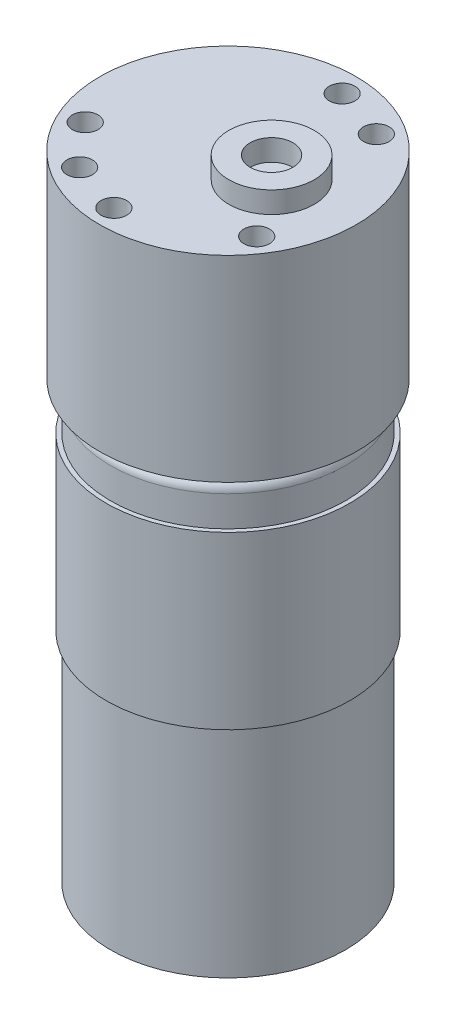
ISO-10303-21;
HEADER;
FILE_DESCRIPTION(('STEP AP214'),'2;1');
FILE_NAME('part.step','',(''),(''),'','','');
FILE_SCHEMA(('AUTOMOTIVE_DESIGN { 1 0 10303 214 1 1 1 1 }'));
ENDSEC;
DATA;
#1=APPLICATION_CONTEXT('core data for automotive mechanical design processes');
#2=APPLICATION_PROTOCOL_DEFINITION('international standard','automotive_design',2000,#1);
#3=PRODUCT_CONTEXT('',#1,'mechanical');
#4=PRODUCT('Part','Part','',(#3));
#5=PRODUCT_RELATED_PRODUCT_CATEGORY('part','',(#4));
#6=PRODUCT_DEFINITION_FORMATION('','',#4);
#7=PRODUCT_DEFINITION_CONTEXT('part definition',#1,'design');
#8=PRODUCT_DEFINITION('design','',#6,#7);
#9=PRODUCT_DEFINITION_SHAPE('','',#8);
#10=(LENGTH_UNIT() NAMED_UNIT(*) SI_UNIT(.MILLI.,.METRE.));
#11=(NAMED_UNIT(*) PLANE_ANGLE_UNIT() SI_UNIT($,.RADIAN.));
#12=(NAMED_UNIT(*) SI_UNIT($,.STERADIAN.) SOLID_ANGLE_UNIT());
#13=UNCERTAINTY_MEASURE_WITH_UNIT(LENGTH_MEASURE(1.E-05),#10,'distance_accuracy_value','');
#14=(GEOMETRIC_REPRESENTATION_CONTEXT(3) GLOBAL_UNCERTAINTY_ASSIGNED_CONTEXT((#13)) GLOBAL_UNIT_ASSIGNED_CONTEXT((#10,
#11,#12)) REPRESENTATION_CONTEXT('',''));
#15=CARTESIAN_POINT('',(0.,0.,0.));
#16=DIRECTION('',(0.,0.,1.));
#17=DIRECTION('',(1.,0.,0.));
#18=AXIS2_PLACEMENT_3D('',#15,#16,#17);
#19=CARTESIAN_POINT('',(69.4163706857569,10.76,4.59413157618666E-13));
#20=DIRECTION('',(0.,-1.,0.));
#21=DIRECTION('',(0.070672985305467,0.,-0.99749953841995));
#22=AXIS2_PLACEMENT_3D('',#19,#20,#21);
#23=TOROIDAL_SURFACE('',#22,12.51,1.24);
#24=CARTESIAN_POINT('',(69.4163706857568,12.,5.10957146463224E-13));
#25=DIRECTION('',(0.,-1.,0.));
#26=DIRECTION('',(0.070672985305467,0.,-0.99749953841995));
#27=AXIS2_PLACEMENT_3D('',#24,#25,#26);
#28=CIRCLE('',#27,12.51);
#29=CARTESIAN_POINT('',(70.3004897319282,12.0000000000006,-12.478719225633));
#30=VERTEX_POINT('',#29);
#31=EDGE_CURVE('E74',#30,#30,#28,.T.);
#32=ORIENTED_EDGE('',*,*,#31,.T.);
#33=EDGE_LOOP('',(#32));
#34=FACE_BOUND('',#33,.T.);
#35=CARTESIAN_POINT('',(69.4163706857569,10.76,4.59404884746867E-13));
#36=DIRECTION('',(0.,-1.,0.));
#37=DIRECTION('',(0.070672985305467,0.,-0.99749953841995));
#38=AXIS2_PLACEMENT_3D('',#35,#36,#37);
#39=CIRCLE('',#38,13.75);
#40=CARTESIAN_POINT('',(70.388124233707,10.7600000000006,-13.7156186532738));
#41=VERTEX_POINT('',#40);
#42=EDGE_CURVE('E40',#41,#41,#39,.T.);
#43=ORIENTED_EDGE('',*,*,#42,.F.);
#44=EDGE_LOOP('',(#43));
#45=FACE_BOUND('',#44,.T.);
#46=ADVANCED_FACE('F34',(#34,#45),#23,.T.);
#47=CARTESIAN_POINT('',(69.4163706857578,-64.0943122375827,-2.65261857901902E-12));
#48=DIRECTION('',(0.,-1.,0.));
#49=DIRECTION('',(0.070672985305467,0.,-0.99749953841995));
#50=AXIS2_PLACEMENT_3D('',#47,#48,#49);
#51=CYLINDRICAL_SURFACE('',#50,13.75);
#52=ORIENTED_EDGE('',*,*,#42,.T.);
#53=EDGE_LOOP('',(#52));
#54=FACE_BOUND('',#53,.T.);
#55=CARTESIAN_POINT('',(69.4163706857569,7.20000000000005,3.11400004335394E-13));
#56=DIRECTION('',(0.,-1.,0.));
#57=DIRECTION('',(0.070672985305467,0.,-0.99749953841995));
#58=AXIS2_PLACEMENT_3D('',#55,#56,#57);
#59=CIRCLE('',#58,13.75);
#60=CARTESIAN_POINT('',(70.3881242337071,7.20000000000063,-13.715618653274));
#61=VERTEX_POINT('',#60);
#62=EDGE_CURVE('E44',#61,#61,#59,.T.);
#63=ORIENTED_EDGE('',*,*,#62,.F.);
#64=EDGE_LOOP('',(#63));
#65=FACE_BOUND('',#64,.T.);
#66=ADVANCED_FACE('F142',(#54,#65),#51,.T.);
#67=CARTESIAN_POINT('',(83.1319893390312,7.20000000000018,0.971753547950482));
#68=DIRECTION('',(0.,1.,0.));
#69=DIRECTION('',(-0.070672985305467,0.,0.99749953841995));
#70=AXIS2_PLACEMENT_3D('',#67,#68,#69);
#71=PLANE('',#70);
#72=ORIENTED_EDGE('',*,*,#62,.T.);
#73=EDGE_LOOP('',(#72));
#74=FACE_BOUND('',#73,.T.);
#75=CARTESIAN_POINT('',(69.4163706857569,7.20000000000005,3.11400004335394E-13));
#76=DIRECTION('',(0.,-1.,0.));
#77=DIRECTION('',(0.070672985305467,0.,-0.99749953841995));
#78=AXIS2_PLACEMENT_3D('',#75,#76,#77);
#79=CIRCLE('',#78,14.25);
#80=CARTESIAN_POINT('',(70.4234607263598,7.20000000000065,-14.214368422484));
#81=VERTEX_POINT('',#80);
#82=EDGE_CURVE('E48',#81,#81,#79,.T.);
#83=ORIENTED_EDGE('',*,*,#82,.F.);
#84=EDGE_LOOP('',(#83));
#85=FACE_BOUND('',#84,.T.);
#86=ADVANCED_FACE('F147',(#74,#85),#71,.T.);
#87=CARTESIAN_POINT('',(69.4163706857578,-64.0943122375827,-2.65261857901902E-12));
#88=DIRECTION('',(0.,-1.,0.));
#89=DIRECTION('',(0.070672985305467,0.,-0.99749953841995));
#90=AXIS2_PLACEMENT_3D('',#87,#88,#89);
#91=CYLINDRICAL_SURFACE('',#90,14.25);
#92=ORIENTED_EDGE('',*,*,#82,.T.);
#93=EDGE_LOOP('',(#92));
#94=FACE_BOUND('',#93,.T.);
#95=CARTESIAN_POINT('',(69.4163706857572,-12.8,-5.20088087863897E-13));
#96=DIRECTION('',(0.,-1.,0.));
#97=DIRECTION('',(0.070672985305467,0.,-0.99749953841995));
#98=AXIS2_PLACEMENT_3D('',#95,#96,#97);
#99=CIRCLE('',#98,14.25);
#100=CARTESIAN_POINT('',(70.4234607263601,-12.7999999999994,-14.2143684224848));
#101=VERTEX_POINT('',#100);
#102=EDGE_CURVE('E53',#101,#101,#99,.T.);
#103=ORIENTED_EDGE('',*,*,#102,.F.);
#104=EDGE_LOOP('',(#103));
#105=FACE_BOUND('',#104,.T.);
#106=ADVANCED_FACE('F192',(#94,#105),#91,.T.);
#107=CARTESIAN_POINT('',(83.6307391082414,-12.7999999999998,1.00709004060238));
#108=DIRECTION('',(0.,-1.,0.));
#109=DIRECTION('',(0.070672985305467,0.,-0.99749953841995));
#110=AXIS2_PLACEMENT_3D('',#107,#108,#109);
#111=PLANE('',#110);
#112=ORIENTED_EDGE('',*,*,#102,.T.);
#113=EDGE_LOOP('',(#112));
#114=FACE_BOUND('',#113,.T.);
#115=CARTESIAN_POINT('',(69.4163706857572,-12.8,-5.20088087863897E-13));
#116=DIRECTION('',(0.,-1.,0.));
#117=DIRECTION('',(0.070672985305467,0.,-0.99749953841995));
#118=AXIS2_PLACEMENT_3D('',#115,#116,#117);
#119=CIRCLE('',#118,13.75);
#120=CARTESIAN_POINT('',(70.3881242337073,-12.7999999999994,-13.7156186532748));
#121=VERTEX_POINT('',#120);
#122=EDGE_CURVE('E56',#121,#121,#119,.T.);
#123=ORIENTED_EDGE('',*,*,#122,.F.);
#124=EDGE_LOOP('',(#123));
#125=FACE_BOUND('',#124,.T.);
#126=ADVANCED_FACE('F188',(#114,#125),#111,.T.);
#127=CARTESIAN_POINT('',(69.4163706857578,-64.0943122375827,-2.65261857901902E-12));
#128=DIRECTION('',(0.,-1.,0.));
#129=DIRECTION('',(0.070672985305467,0.,-0.99749953841995));
#130=AXIS2_PLACEMENT_3D('',#127,#128,#129);
#131=CYLINDRICAL_SURFACE('',#130,13.75);
#132=ORIENTED_EDGE('',*,*,#122,.T.);
#133=EDGE_LOOP('',(#132));
#134=FACE_BOUND('',#133,.T.);
#135=CARTESIAN_POINT('',(69.4163706857575,-38.2999999999999,-1.58023540541799E-12));
#136=DIRECTION('',(0.,-1.,0.));
#137=DIRECTION('',(0.070672985305467,0.,-0.99749953841995));
#138=AXIS2_PLACEMENT_3D('',#135,#136,#137);
#139=CIRCLE('',#138,13.75);
#140=CARTESIAN_POINT('',(70.3881242337077,-38.2999999999994,-13.7156186532759));
#141=VERTEX_POINT('',#140);
#142=EDGE_CURVE('E59',#141,#141,#139,.T.);
#143=ORIENTED_EDGE('',*,*,#142,.F.);
#144=EDGE_LOOP('',(#143));
#145=FACE_BOUND('',#144,.T.);
#146=ADVANCED_FACE('F184',(#134,#145),#131,.T.);
#147=CARTESIAN_POINT('',(69.4163706857575,-38.2999999999999,-1.58032793038194E-12));
#148=DIRECTION('',(0.,-1.,0.));
#149=DIRECTION('',(0.070672985305467,0.,-0.99749953841995));
#150=AXIS2_PLACEMENT_3D('',#147,#148,#149);
#151=PLANE('',#150);
#152=ORIENTED_EDGE('',*,*,#142,.T.);
#153=EDGE_LOOP('',(#152));
#154=FACE_BOUND('',#153,.T.);
#155=ADVANCED_FACE('F179',(#154),#151,.T.);
#156=CARTESIAN_POINT('',(69.4163706857565,35.8000000000001,1.50042797618038E-12));
#157=DIRECTION('',(0.,1.,0.));
#158=DIRECTION('',(-0.070672985305467,0.,0.99749953841995));
#159=AXIS2_PLACEMENT_3D('',#156,#157,#158);
#160=PLANE('',#159);
#161=CARTESIAN_POINT('',(74.9026181470663,35.8000000000001,0.388701419181569));
#162=DIRECTION('',(0.,1.,0.));
#163=DIRECTION('',(-0.070672985305467,0.,0.99749953841995));
#164=AXIS2_PLACEMENT_3D('',#161,#162,#163);
#165=CIRCLE('',#164,5.);
#166=CARTESIAN_POINT('',(74.5492532205389,35.7999999999999,5.37619911128132));
#167=VERTEX_POINT('',#166);
#168=EDGE_CURVE('E114',#167,#167,#165,.T.);
#169=ORIENTED_EDGE('',*,*,#168,.F.);
#170=EDGE_LOOP('',(#169));
#171=FACE_BOUND('',#170,.T.);
#172=CARTESIAN_POINT('',(58.1764152709107,35.7999999999997,5.46931460717845));
#173=DIRECTION('',(0.,1.,0.));
#174=DIRECTION('',(-0.070672985305467,0.,0.99749953841995));
#175=AXIS2_PLACEMENT_3D('',#172,#173,#174);
#176=CIRCLE('',#175,1.5);
#177=CARTESIAN_POINT('',(58.0704057929525,35.7999999999996,6.96556391480837));
#178=VERTEX_POINT('',#177);
#179=EDGE_CURVE('E84',#178,#178,#176,.T.);
#180=ORIENTED_EDGE('',*,*,#179,.F.);
#181=EDGE_LOOP('',(#180));
#182=FACE_BOUND('',#181,.T.);
#183=CARTESIAN_POINT('',(62.4169410626841,35.7999999999995,10.3565430985289));
#184=DIRECTION('',(0.,1.,0.));
#185=DIRECTION('',(-0.070672985305467,0.,0.99749953841995));
#186=AXIS2_PLACEMENT_3D('',#183,#184,#185);
#187=CIRCLE('',#186,1.5);
#188=CARTESIAN_POINT('',(62.3109315847259,35.7999999999995,11.8527924061589));
#189=VERTEX_POINT('',#188);
#190=EDGE_CURVE('E91',#189,#189,#187,.T.);
#191=ORIENTED_EDGE('',*,*,#190,.F.);
#192=EDGE_LOOP('',(#191));
#193=FACE_BOUND('',#192,.T.);
#194=CARTESIAN_POINT('',(68.5329583694382,35.7999999999995,12.4687442302509));
#195=DIRECTION('',(0.,1.,0.));
#196=DIRECTION('',(-0.070672985305467,0.,0.99749953841995));
#197=AXIS2_PLACEMENT_3D('',#194,#195,#196);
#198=CIRCLE('',#197,1.5);
#199=CARTESIAN_POINT('',(68.42694889148,35.7999999999995,13.9649935378808));
#200=VERTEX_POINT('',#199);
#201=EDGE_CURVE('E97',#200,#200,#198,.T.);
#202=ORIENTED_EDGE('',*,*,#201,.F.);
#203=EDGE_LOOP('',(#202));
#204=FACE_BOUND('',#203,.T.);
#205=CARTESIAN_POINT('',(79.772913784284,35.7999999999999,6.9994296230739));
#206=DIRECTION('',(0.,1.,0.));
#207=DIRECTION('',(-0.070672985305467,0.,0.99749953841995));
#208=AXIS2_PLACEMENT_3D('',#205,#206,#207);
#209=CIRCLE('',#208,1.5);
#210=CARTESIAN_POINT('',(79.6669043063258,35.7999999999998,8.49567893070382));
#211=VERTEX_POINT('',#210);
#212=EDGE_CURVE('E103',#211,#211,#209,.T.);
#213=ORIENTED_EDGE('',*,*,#212,.F.);
#214=EDGE_LOOP('',(#213));
#215=FACE_BOUND('',#214,.T.);
#216=CARTESIAN_POINT('',(76.4158003088289,35.8000000000006,-10.356543098526));
#217=DIRECTION('',(0.,1.,0.));
#218=DIRECTION('',(-0.070672985305467,0.,0.99749953841995));
#219=AXIS2_PLACEMENT_3D('',#216,#217,#218);
#220=CIRCLE('',#219,1.5);
#221=CARTESIAN_POINT('',(76.3097908308707,35.8000000000005,-8.86029379089603));
#222=VERTEX_POINT('',#221);
#223=EDGE_CURVE('E109',#222,#222,#220,.T.);
#224=ORIENTED_EDGE('',*,*,#223,.F.);
#225=EDGE_LOOP('',(#224));
#226=FACE_BOUND('',#225,.T.);
#227=CARTESIAN_POINT('',(70.2997830020749,35.8000000000006,-12.4687442302479));
#228=DIRECTION('',(0.,1.,0.));
#229=DIRECTION('',(-0.070672985305467,0.,0.99749953841995));
#230=AXIS2_PLACEMENT_3D('',#227,#228,#229);
#231=CIRCLE('',#230,1.5);
#232=CARTESIAN_POINT('',(70.1937735241167,35.8000000000005,-10.972494922618));
#233=VERTEX_POINT('',#232);
#234=EDGE_CURVE('E78',#233,#233,#231,.T.);
#235=ORIENTED_EDGE('',*,*,#234,.F.);
#236=EDGE_LOOP('',(#235));
#237=FACE_BOUND('',#236,.T.);
#238=CARTESIAN_POINT('',(69.4163706857565,35.8000000000001,1.50042797618038E-12));
#239=DIRECTION('',(0.,-1.,0.));
#240=DIRECTION('',(0.070672985305467,0.,-0.99749953841995));
#241=AXIS2_PLACEMENT_3D('',#238,#239,#240);
#242=CIRCLE('',#241,15.0045873798302);
#243=CARTESIAN_POINT('',(70.4767896691659,35.8000000000007,-14.9670689855609));
#244=VERTEX_POINT('',#243);
#245=EDGE_CURVE('E62',#244,#244,#242,.T.);
#246=ORIENTED_EDGE('',*,*,#245,.F.);
#247=EDGE_LOOP('',(#246));
#248=FACE_BOUND('',#247,.T.);
#249=ADVANCED_FACE('F175',(#171,#182,#193,#204,#215,#226,#237,#248),#160,.T.);
#250=CARTESIAN_POINT('',(69.4163706857578,-64.0943122375827,-2.65261857901902E-12));
#251=DIRECTION('',(0.,-1.,0.));
#252=DIRECTION('',(0.070672985305467,0.,-0.99749953841995));
#253=AXIS2_PLACEMENT_3D('',#250,#251,#252);
#254=CYLINDRICAL_SURFACE('',#253,15.0045873798302);
#255=ORIENTED_EDGE('',*,*,#245,.T.);
#256=EDGE_LOOP('',(#255));
#257=FACE_BOUND('',#256,.T.);
#258=CARTESIAN_POINT('',(69.4163706857568,12.8,5.44216670151195E-13));
#259=DIRECTION('',(0.,-1.,0.));
#260=DIRECTION('',(0.070672985305467,0.,-0.99749953841995));
#261=AXIS2_PLACEMENT_3D('',#258,#259,#260);
#262=CIRCLE('',#261,15.0045873798302);
#263=CARTESIAN_POINT('',(70.4767896691662,12.8000000000007,-14.9670689855619));
#264=VERTEX_POINT('',#263);
#265=EDGE_CURVE('E65',#264,#264,#262,.T.);
#266=ORIENTED_EDGE('',*,*,#265,.F.);
#267=EDGE_LOOP('',(#266));
#268=FACE_BOUND('',#267,.T.);
#269=ADVANCED_FACE('F171',(#257,#268),#254,.T.);
#270=CARTESIAN_POINT('',(84.3834396713193,12.8000000000002,1.06041898340988));
#271=DIRECTION('',(0.,-1.,0.));
#272=DIRECTION('',(0.070672985305467,0.,-0.99749953841995));
#273=AXIS2_PLACEMENT_3D('',#270,#271,#272);
#274=PLANE('',#273);
#275=ORIENTED_EDGE('',*,*,#265,.T.);
#276=EDGE_LOOP('',(#275));
#277=FACE_BOUND('',#276,.T.);
#278=CARTESIAN_POINT('',(69.4163706857568,12.8,5.44216670151195E-13));
#279=DIRECTION('',(0.,-1.,0.));
#280=DIRECTION('',(0.070672985305467,0.,-0.99749953841995));
#281=AXIS2_PLACEMENT_3D('',#278,#279,#280);
#282=CIRCLE('',#281,12.5);
#283=CARTESIAN_POINT('',(70.2997830020752,12.8000000000006,-12.4687442302488));
#284=VERTEX_POINT('',#283);
#285=EDGE_CURVE('E68',#284,#284,#282,.T.);
#286=ORIENTED_EDGE('',*,*,#285,.F.);
#287=EDGE_LOOP('',(#286));
#288=FACE_BOUND('',#287,.T.);
#289=ADVANCED_FACE('F164',(#277,#288),#274,.T.);
#290=CARTESIAN_POINT('',(69.4163706857578,-64.0943122375827,-2.65261857901902E-12));
#291=DIRECTION('',(0.,-1.,0.));
#292=DIRECTION('',(0.070672985305467,0.,-0.99749953841995));
#293=AXIS2_PLACEMENT_3D('',#290,#291,#292);
#294=CYLINDRICAL_SURFACE('',#293,12.5);
#295=ORIENTED_EDGE('',*,*,#285,.T.);
#296=EDGE_LOOP('',(#295));
#297=FACE_BOUND('',#296,.T.);
#298=CARTESIAN_POINT('',(69.4163706857568,12.,5.10957146463224E-13));
#299=DIRECTION('',(0.,-1.,0.));
#300=DIRECTION('',(0.070672985305467,0.,-0.99749953841995));
#301=AXIS2_PLACEMENT_3D('',#298,#299,#300);
#302=CIRCLE('',#301,12.5);
#303=CARTESIAN_POINT('',(70.2997830020752,12.0000000000006,-12.4687442302489));
#304=VERTEX_POINT('',#303);
#305=EDGE_CURVE('E71',#304,#304,#302,.T.);
#306=ORIENTED_EDGE('',*,*,#305,.F.);
#307=EDGE_LOOP('',(#306));
#308=FACE_BOUND('',#307,.T.);
#309=ADVANCED_FACE('F154',(#297,#308),#294,.T.);
#310=CARTESIAN_POINT('',(81.8851149160062,12.0000000000002,0.883412316318848));
#311=DIRECTION('',(0.,1.,0.));
#312=DIRECTION('',(-0.070672985305467,0.,0.99749953841995));
#313=AXIS2_PLACEMENT_3D('',#310,#311,#312);
#314=PLANE('',#313);
#315=ORIENTED_EDGE('',*,*,#305,.T.);
#316=EDGE_LOOP('',(#315));
#317=FACE_BOUND('',#316,.T.);
#318=ORIENTED_EDGE('',*,*,#31,.F.);
#319=EDGE_LOOP('',(#318));
#320=FACE_BOUND('',#319,.T.);
#321=ADVANCED_FACE('F151',(#317,#320),#314,.T.);
#322=CARTESIAN_POINT('',(70.2997830020749,31.8000000000006,-12.468744230248));
#323=DIRECTION('',(0.,1.,0.));
#324=DIRECTION('',(-0.070672985305467,0.,0.99749953841995));
#325=AXIS2_PLACEMENT_3D('',#322,#323,#324);
#326=CYLINDRICAL_SURFACE('',#325,1.5);
#327=CARTESIAN_POINT('',(70.2997830020749,31.8000000000006,-12.468744230248));
#328=DIRECTION('',(0.,1.,0.));
#329=DIRECTION('',(-0.070672985305467,0.,0.99749953841995));
#330=AXIS2_PLACEMENT_3D('',#327,#328,#329);
#331=CIRCLE('',#330,1.5);
#332=CARTESIAN_POINT('',(70.1937735241167,31.8000000000005,-10.9724949226181));
#333=VERTEX_POINT('',#332);
#334=EDGE_CURVE('E77',#333,#333,#331,.T.);
#335=ORIENTED_EDGE('',*,*,#334,.F.);
#336=EDGE_LOOP('',(#335));
#337=FACE_BOUND('',#336,.T.);
#338=ORIENTED_EDGE('',*,*,#234,.T.);
#339=EDGE_LOOP('',(#338));
#340=FACE_BOUND('',#339,.T.);
#341=ADVANCED_FACE('F153',(#337,#340),#326,.F.);
#342=CARTESIAN_POINT('',(70.2997830020749,31.8000000000006,-12.468744230248));
#343=DIRECTION('',(0.,1.,0.));
#344=DIRECTION('',(-0.070672985305467,0.,0.99749953841995));
#345=AXIS2_PLACEMENT_3D('',#342,#343,#344);
#346=PLANE('',#345);
#347=ORIENTED_EDGE('',*,*,#334,.T.);
#348=EDGE_LOOP('',(#347));
#349=FACE_BOUND('',#348,.T.);
#350=ADVANCED_FACE('F161',(#349),#346,.T.);
#351=CARTESIAN_POINT('',(76.415800308829,31.8000000000006,-10.3565430985261));
#352=DIRECTION('',(0.,1.,0.));
#353=DIRECTION('',(-0.070672985305467,0.,0.99749953841995));
#354=AXIS2_PLACEMENT_3D('',#351,#352,#353);
#355=CYLINDRICAL_SURFACE('',#354,1.5);
#356=CARTESIAN_POINT('',(76.415800308829,31.8000000000006,-10.3565430985261));
#357=DIRECTION('',(0.,1.,0.));
#358=DIRECTION('',(-0.070672985305467,0.,0.99749953841995));
#359=AXIS2_PLACEMENT_3D('',#356,#357,#358);
#360=CIRCLE('',#359,1.5);
#361=CARTESIAN_POINT('',(76.3097908308708,31.8000000000005,-8.8602937908962));
#362=VERTEX_POINT('',#361);
#363=EDGE_CURVE('E81',#362,#362,#360,.T.);
#364=ORIENTED_EDGE('',*,*,#363,.F.);
#365=EDGE_LOOP('',(#364));
#366=FACE_BOUND('',#365,.T.);
#367=ORIENTED_EDGE('',*,*,#223,.T.);
#368=EDGE_LOOP('',(#367));
#369=FACE_BOUND('',#368,.T.);
#370=ADVANCED_FACE('F265',(#366,#369),#355,.F.);
#371=CARTESIAN_POINT('',(76.415800308829,31.8000000000006,-10.3565430985261));
#372=DIRECTION('',(0.,1.,0.));
#373=DIRECTION('',(-0.070672985305467,0.,0.99749953841995));
#374=AXIS2_PLACEMENT_3D('',#371,#372,#373);
#375=PLANE('',#374);
#376=ORIENTED_EDGE('',*,*,#363,.T.);
#377=EDGE_LOOP('',(#376));
#378=FACE_BOUND('',#377,.T.);
#379=ADVANCED_FACE('F274',(#378),#375,.T.);
#380=CARTESIAN_POINT('',(79.7729137842841,31.7999999999999,6.99942962307373));
#381=DIRECTION('',(0.,1.,0.));
#382=DIRECTION('',(-0.070672985305467,0.,0.99749953841995));
#383=AXIS2_PLACEMENT_3D('',#380,#381,#382);
#384=CYLINDRICAL_SURFACE('',#383,1.5);
#385=CARTESIAN_POINT('',(79.7729137842841,31.7999999999999,6.99942962307373));
#386=DIRECTION('',(0.,1.,0.));
#387=DIRECTION('',(-0.070672985305467,0.,0.99749953841995));
#388=AXIS2_PLACEMENT_3D('',#385,#386,#387);
#389=CIRCLE('',#388,1.5);
#390=CARTESIAN_POINT('',(79.6669043063258,31.7999999999998,8.49567893070365));
#391=VERTEX_POINT('',#390);
#392=EDGE_CURVE('E106',#391,#391,#389,.T.);
#393=ORIENTED_EDGE('',*,*,#392,.F.);
#394=EDGE_LOOP('',(#393));
#395=FACE_BOUND('',#394,.T.);
#396=ORIENTED_EDGE('',*,*,#212,.T.);
#397=EDGE_LOOP('',(#396));
#398=FACE_BOUND('',#397,.T.);
#399=ADVANCED_FACE('F284',(#395,#398),#384,.F.);
#400=CARTESIAN_POINT('',(79.7729137842841,31.7999999999999,6.99942962307373));
#401=DIRECTION('',(0.,1.,0.));
#402=DIRECTION('',(-0.070672985305467,0.,0.99749953841995));
#403=AXIS2_PLACEMENT_3D('',#400,#401,#402);
#404=PLANE('',#403);
#405=ORIENTED_EDGE('',*,*,#392,.T.);
#406=EDGE_LOOP('',(#405));
#407=FACE_BOUND('',#406,.T.);
#408=ADVANCED_FACE('F294',(#407),#404,.T.);
#409=CARTESIAN_POINT('',(68.5329583694383,31.7999999999995,12.4687442302507));
#410=DIRECTION('',(0.,1.,0.));
#411=DIRECTION('',(-0.070672985305467,0.,0.99749953841995));
#412=AXIS2_PLACEMENT_3D('',#409,#410,#411);
#413=CYLINDRICAL_SURFACE('',#412,1.5);
#414=CARTESIAN_POINT('',(68.5329583694383,31.7999999999995,12.4687442302507));
#415=DIRECTION('',(0.,1.,0.));
#416=DIRECTION('',(-0.070672985305467,0.,0.99749953841995));
#417=AXIS2_PLACEMENT_3D('',#414,#415,#416);
#418=CIRCLE('',#417,1.5);
#419=CARTESIAN_POINT('',(68.4269488914801,31.7999999999995,13.9649935378806));
#420=VERTEX_POINT('',#419);
#421=EDGE_CURVE('E100',#420,#420,#418,.T.);
#422=ORIENTED_EDGE('',*,*,#421,.F.);
#423=EDGE_LOOP('',(#422));
#424=FACE_BOUND('',#423,.T.);
#425=ORIENTED_EDGE('',*,*,#201,.T.);
#426=EDGE_LOOP('',(#425));
#427=FACE_BOUND('',#426,.T.);
#428=ADVANCED_FACE('F304',(#424,#427),#413,.F.);
#429=CARTESIAN_POINT('',(68.5329583694383,31.7999999999995,12.4687442302507));
#430=DIRECTION('',(0.,1.,0.));
#431=DIRECTION('',(-0.070672985305467,0.,0.99749953841995));
#432=AXIS2_PLACEMENT_3D('',#429,#430,#431);
#433=PLANE('',#432);
#434=ORIENTED_EDGE('',*,*,#421,.T.);
#435=EDGE_LOOP('',(#434));
#436=FACE_BOUND('',#435,.T.);
#437=ADVANCED_FACE('F314',(#436),#433,.T.);
#438=CARTESIAN_POINT('',(62.4169410626842,31.7999999999995,10.3565430985288));
#439=DIRECTION('',(0.,1.,0.));
#440=DIRECTION('',(-0.070672985305467,0.,0.99749953841995));
#441=AXIS2_PLACEMENT_3D('',#438,#439,#440);
#442=CYLINDRICAL_SURFACE('',#441,1.5);
#443=CARTESIAN_POINT('',(62.4169410626842,31.7999999999995,10.3565430985288));
#444=DIRECTION('',(0.,1.,0.));
#445=DIRECTION('',(-0.070672985305467,0.,0.99749953841995));
#446=AXIS2_PLACEMENT_3D('',#443,#444,#445);
#447=CIRCLE('',#446,1.5);
#448=CARTESIAN_POINT('',(62.310931584726,31.7999999999995,11.8527924061587));
#449=VERTEX_POINT('',#448);
#450=EDGE_CURVE('E94',#449,#449,#447,.T.);
#451=ORIENTED_EDGE('',*,*,#450,.F.);
#452=EDGE_LOOP('',(#451));
#453=FACE_BOUND('',#452,.T.);
#454=ORIENTED_EDGE('',*,*,#190,.T.);
#455=EDGE_LOOP('',(#454));
#456=FACE_BOUND('',#455,.T.);
#457=ADVANCED_FACE('F324',(#453,#456),#442,.F.);
#458=CARTESIAN_POINT('',(62.4169410626842,31.7999999999995,10.3565430985288));
#459=DIRECTION('',(0.,1.,0.));
#460=DIRECTION('',(-0.070672985305467,0.,0.99749953841995));
#461=AXIS2_PLACEMENT_3D('',#458,#459,#460);
#462=PLANE('',#461);
#463=ORIENTED_EDGE('',*,*,#450,.T.);
#464=EDGE_LOOP('',(#463));
#465=FACE_BOUND('',#464,.T.);
#466=ADVANCED_FACE('F334',(#465),#462,.T.);
#467=CARTESIAN_POINT('',(58.1764152709108,31.7999999999997,5.46931460717828));
#468=DIRECTION('',(0.,1.,0.));
#469=DIRECTION('',(-0.070672985305467,0.,0.99749953841995));
#470=AXIS2_PLACEMENT_3D('',#467,#468,#469);
#471=CYLINDRICAL_SURFACE('',#470,1.5);
#472=CARTESIAN_POINT('',(58.1764152709108,31.7999999999997,5.46931460717828));
#473=DIRECTION('',(0.,1.,0.));
#474=DIRECTION('',(-0.070672985305467,0.,0.99749953841995));
#475=AXIS2_PLACEMENT_3D('',#472,#473,#474);
#476=CIRCLE('',#475,1.5);
#477=CARTESIAN_POINT('',(58.0704057929526,31.7999999999996,6.96556391480821));
#478=VERTEX_POINT('',#477);
#479=EDGE_CURVE('E87',#478,#478,#476,.T.);
#480=ORIENTED_EDGE('',*,*,#479,.F.);
#481=EDGE_LOOP('',(#480));
#482=FACE_BOUND('',#481,.T.);
#483=ORIENTED_EDGE('',*,*,#179,.T.);
#484=EDGE_LOOP('',(#483));
#485=FACE_BOUND('',#484,.T.);
#486=ADVANCED_FACE('F137',(#482,#485),#471,.F.);
#487=CARTESIAN_POINT('',(58.1764152709108,31.7999999999997,5.46931460717828));
#488=DIRECTION('',(0.,1.,0.));
#489=DIRECTION('',(-0.070672985305467,0.,0.99749953841995));
#490=AXIS2_PLACEMENT_3D('',#487,#488,#489);
#491=PLANE('',#490);
#492=ORIENTED_EDGE('',*,*,#479,.T.);
#493=EDGE_LOOP('',(#492));
#494=FACE_BOUND('',#493,.T.);
#495=ADVANCED_FACE('F128',(#494),#491,.T.);
#496=CARTESIAN_POINT('',(74.9026181470662,38.3000000000001,0.388701419181673));
#497=DIRECTION('',(0.,1.,0.));
#498=DIRECTION('',(-0.070672985305467,0.,0.99749953841995));
#499=AXIS2_PLACEMENT_3D('',#496,#497,#498);
#500=PLANE('',#499);
#501=CARTESIAN_POINT('',(74.9026181470662,38.3000000000001,0.388701419181673));
#502=DIRECTION('',(0.,1.,0.));
#503=DIRECTION('',(-0.070672985305467,0.,0.99749953841995));
#504=AXIS2_PLACEMENT_3D('',#501,#502,#503);
#505=CIRCLE('',#504,5.);
#506=CARTESIAN_POINT('',(74.5492532205389,38.2999999999999,5.37619911128142));
#507=VERTEX_POINT('',#506);
#508=EDGE_CURVE('E88',#507,#507,#505,.T.);
#509=ORIENTED_EDGE('',*,*,#508,.T.);
#510=EDGE_LOOP('',(#509));
#511=FACE_BOUND('',#510,.T.);
#512=CARTESIAN_POINT('',(74.9026181470662,38.3000000000001,0.388701419181673));
#513=DIRECTION('',(0.,1.,0.));
#514=DIRECTION('',(-0.070672985305467,0.,0.99749953841995));
#515=AXIS2_PLACEMENT_3D('',#512,#513,#514);
#516=CIRCLE('',#515,2.5);
#517=CARTESIAN_POINT('',(74.7259356838026,38.3,2.88245026523155));
#518=VERTEX_POINT('',#517);
#519=EDGE_CURVE('E117',#518,#518,#516,.T.);
#520=ORIENTED_EDGE('',*,*,#519,.F.);
#521=EDGE_LOOP('',(#520));
#522=FACE_BOUND('',#521,.T.);
#523=ADVANCED_FACE('F125',(#511,#522),#500,.T.);
#524=CARTESIAN_POINT('',(74.9026181470662,38.3000000000001,0.388701419181673));
#525=DIRECTION('',(0.,-1.,0.));
#526=DIRECTION('',(0.070672985305467,0.,-0.99749953841995));
#527=AXIS2_PLACEMENT_3D('',#524,#525,#526);
#528=CYLINDRICAL_SURFACE('',#527,5.);
#529=ORIENTED_EDGE('',*,*,#508,.F.);
#530=EDGE_LOOP('',(#529));
#531=FACE_BOUND('',#530,.T.);
#532=ORIENTED_EDGE('',*,*,#168,.T.);
#533=EDGE_LOOP('',(#532));
#534=FACE_BOUND('',#533,.T.);
#535=ADVANCED_FACE('F127',(#531,#534),#528,.T.);
#536=CARTESIAN_POINT('',(74.9026181470662,38.3000000000001,0.388701419181673));
#537=DIRECTION('',(0.,-1.,0.));
#538=DIRECTION('',(0.070672985305467,0.,-0.99749953841995));
#539=AXIS2_PLACEMENT_3D('',#536,#537,#538);
#540=CYLINDRICAL_SURFACE('',#539,2.5);
#541=ORIENTED_EDGE('',*,*,#519,.T.);
#542=EDGE_LOOP('',(#541));
#543=FACE_BOUND('',#542,.T.);
#544=CARTESIAN_POINT('',(74.9026181470663,35.8000000000001,0.388701419181569));
#545=DIRECTION('',(0.,1.,0.));
#546=DIRECTION('',(-0.070672985305467,0.,0.99749953841995));
#547=AXIS2_PLACEMENT_3D('',#544,#545,#546);
#548=CIRCLE('',#547,2.5);
#549=CARTESIAN_POINT('',(74.7259356838026,35.8,2.88245026523144));
#550=VERTEX_POINT('',#549);
#551=EDGE_CURVE('E10',#550,#550,#548,.F.);
#552=ORIENTED_EDGE('',*,*,#551,.T.);
#553=EDGE_LOOP('',(#552));
#554=FACE_BOUND('',#553,.T.);
#555=ADVANCED_FACE('F123',(#543,#554),#540,.F.);
#556=ORIENTED_EDGE('',*,*,#551,.F.);
#557=EDGE_LOOP('',(#556));
#558=FACE_BOUND('',#557,.T.);
#559=ADVANCED_FACE('F181',(#558),#160,.T.);
#560=CLOSED_SHELL('',(#46,#66,#86,#106,#126,#146,#155,#249,#269,#289,#309,#321,#341,#350,#370,
#379,#399,#408,#428,#437,#457,#466,#486,#495,#523,#535,#555,#559));
#561=MANIFOLD_SOLID_BREP('B2',#560);
#562=ADVANCED_BREP_SHAPE_REPRESENTATION('',(#18,#561),#14);
#563=SHAPE_DEFINITION_REPRESENTATION(#9,#562);
ENDSEC;
END-ISO-10303-21;
